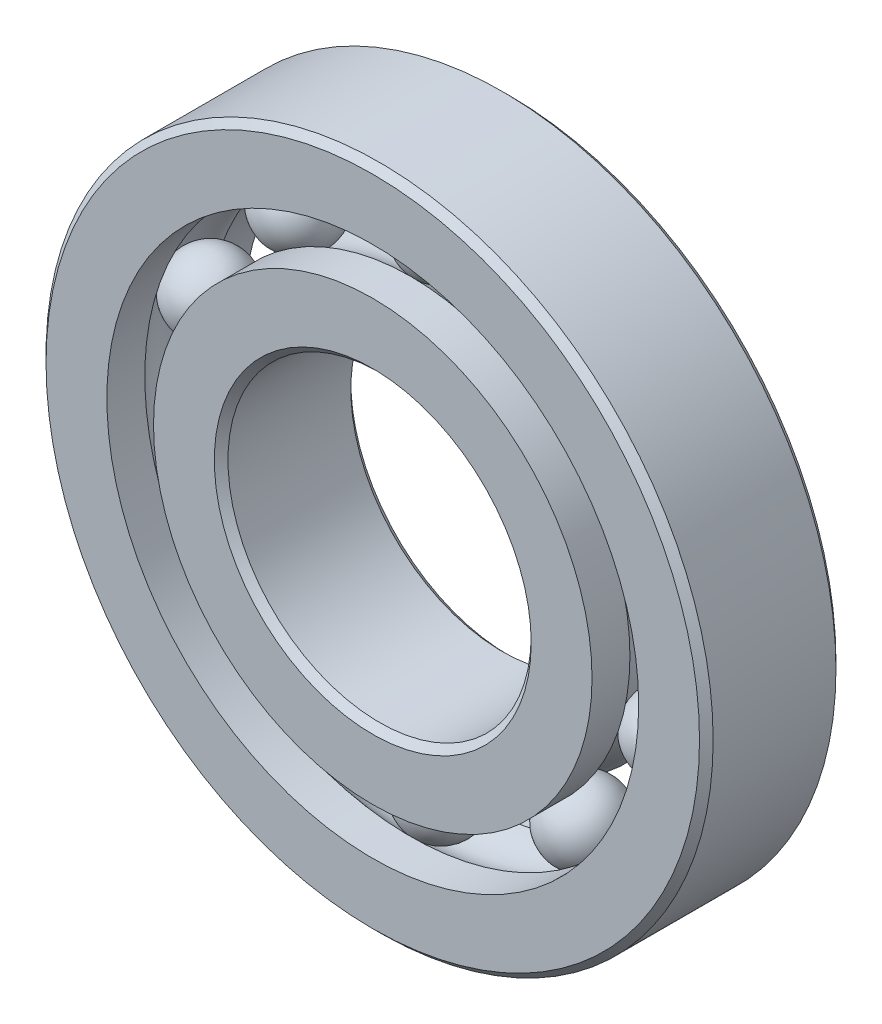
ISO-10303-21;
HEADER;
FILE_DESCRIPTION(('STEP AP214'),'2;1');
FILE_NAME('part.step','',(''),(''),'','','');
FILE_SCHEMA(('AUTOMOTIVE_DESIGN { 1 0 10303 214 1 1 1 1 }'));
ENDSEC;
DATA;
#1=APPLICATION_CONTEXT('core data for automotive mechanical design processes');
#2=APPLICATION_PROTOCOL_DEFINITION('international standard','automotive_design',2000,#1);
#3=PRODUCT_CONTEXT('',#1,'mechanical');
#4=PRODUCT('Part','Part','',(#3));
#5=PRODUCT_RELATED_PRODUCT_CATEGORY('part','',(#4));
#6=PRODUCT_DEFINITION_FORMATION('','',#4);
#7=PRODUCT_DEFINITION_CONTEXT('part definition',#1,'design');
#8=PRODUCT_DEFINITION('design','',#6,#7);
#9=PRODUCT_DEFINITION_SHAPE('','',#8);
#10=(LENGTH_UNIT() NAMED_UNIT(*) SI_UNIT(.MILLI.,.METRE.));
#11=(NAMED_UNIT(*) PLANE_ANGLE_UNIT() SI_UNIT($,.RADIAN.));
#12=(NAMED_UNIT(*) SI_UNIT($,.STERADIAN.) SOLID_ANGLE_UNIT());
#13=UNCERTAINTY_MEASURE_WITH_UNIT(LENGTH_MEASURE(1.E-05),#10,'distance_accuracy_value','');
#14=(GEOMETRIC_REPRESENTATION_CONTEXT(3) GLOBAL_UNCERTAINTY_ASSIGNED_CONTEXT((#13)) GLOBAL_UNIT_ASSIGNED_CONTEXT((#10,
#11,#12)) REPRESENTATION_CONTEXT('',''));
#15=CARTESIAN_POINT('',(0.,0.,0.));
#16=DIRECTION('',(0.,0.,1.));
#17=DIRECTION('',(1.,0.,0.));
#18=AXIS2_PLACEMENT_3D('',#15,#16,#17);
#19=CARTESIAN_POINT('',(-7.46487270411427,10.2745158285619,0.));
#20=DIRECTION('',(0.,0.,1.));
#21=DIRECTION('',(-0.587785252292462,0.809016994374955,0.));
#22=AXIS2_PLACEMENT_3D('',#19,#20,#21);
#23=SPHERICAL_SURFACE('',#22,2.00284122335654);
#24=CARTESIAN_POINT('',(-7.46487270411427,10.2745158285619,2.00284122335654));
#25=VERTEX_POINT('',#24);
#26=VERTEX_LOOP('',#25);
#27=FACE_BOUND('',#26,.T.);
#28=ADVANCED_FACE('F43',(#27),#23,.T.);
#29=CLOSED_SHELL('',(#28));
#30=MANIFOLD_SOLID_BREP('B2',#29);
#31=CARTESIAN_POINT('',(-12.0784177569484,3.92451582856197,0.));
#32=DIRECTION('',(0.,0.,1.));
#33=DIRECTION('',(-0.95105651629515,0.309016994374958,0.));
#34=AXIS2_PLACEMENT_3D('',#31,#32,#33);
#35=SPHERICAL_SURFACE('',#34,2.00284122335654);
#36=CARTESIAN_POINT('',(-12.0784177569484,3.92451582856197,2.00284122335654));
#37=VERTEX_POINT('',#36);
#38=VERTEX_LOOP('',#37);
#39=FACE_BOUND('',#38,.T.);
#40=ADVANCED_FACE('F64',(#39),#35,.T.);
#41=CLOSED_SHELL('',(#40));
#42=MANIFOLD_SOLID_BREP('B6',#41);
#43=CARTESIAN_POINT('',(-12.0784177569485,-3.92451582856172,0.));
#44=DIRECTION('',(0.,0.,1.));
#45=DIRECTION('',(-0.951056516295157,-0.309016994374938,0.));
#46=AXIS2_PLACEMENT_3D('',#43,#44,#45);
#47=SPHERICAL_SURFACE('',#46,2.00284122335654);
#48=CARTESIAN_POINT('',(-12.0784177569485,-3.92451582856172,2.00284122335654));
#49=VERTEX_POINT('',#48);
#50=VERTEX_LOOP('',#49);
#51=FACE_BOUND('',#50,.T.);
#52=ADVANCED_FACE('F87',(#51),#47,.T.);
#53=CLOSED_SHELL('',(#52));
#54=MANIFOLD_SOLID_BREP('B39',#53);
#55=CARTESIAN_POINT('',(-7.4648727041145,-10.2745158285618,0.));
#56=DIRECTION('',(0.,0.,1.));
#57=DIRECTION('',(-0.58778525229248,-0.809016994374942,0.));
#58=AXIS2_PLACEMENT_3D('',#55,#56,#57);
#59=SPHERICAL_SURFACE('',#58,2.00284122335654);
#60=CARTESIAN_POINT('',(-7.4648727041145,-10.2745158285618,2.00284122335654));
#61=VERTEX_POINT('',#60);
#62=VERTEX_LOOP('',#61);
#63=FACE_BOUND('',#62,.T.);
#64=ADVANCED_FACE('F107',(#63),#59,.T.);
#65=CLOSED_SHELL('',(#64));
#66=MANIFOLD_SOLID_BREP('B60',#65);
#67=CARTESIAN_POINT('',(0.,-12.7,0.));
#68=DIRECTION('',(0.,0.,1.));
#69=DIRECTION('',(0.,-1.,0.));
#70=AXIS2_PLACEMENT_3D('',#67,#68,#69);
#71=SPHERICAL_SURFACE('',#70,2.00284122335654);
#72=CARTESIAN_POINT('',(0.,-12.7,2.00284122335654));
#73=VERTEX_POINT('',#72);
#74=VERTEX_LOOP('',#73);
#75=FACE_BOUND('',#74,.T.);
#76=ADVANCED_FACE('F127',(#75),#71,.T.);
#77=CLOSED_SHELL('',(#76));
#78=MANIFOLD_SOLID_BREP('B83',#77);
#79=CARTESIAN_POINT('',(7.46487270411435,-10.2745158285619,0.));
#80=DIRECTION('',(0.,0.,1.));
#81=DIRECTION('',(0.587785252292469,-0.809016994374951,0.));
#82=AXIS2_PLACEMENT_3D('',#79,#80,#81);
#83=SPHERICAL_SURFACE('',#82,2.00284122335654);
#84=CARTESIAN_POINT('',(7.46487270411435,-10.2745158285619,2.00284122335654));
#85=VERTEX_POINT('',#84);
#86=VERTEX_LOOP('',#85);
#87=FACE_BOUND('',#86,.T.);
#88=ADVANCED_FACE('F147',(#87),#83,.T.);
#89=CLOSED_SHELL('',(#88));
#90=MANIFOLD_SOLID_BREP('B103',#89);
#91=CARTESIAN_POINT('',(12.0784177569484,-3.92451582856189,0.));
#92=DIRECTION('',(0.,0.,1.));
#93=DIRECTION('',(0.951056516295152,-0.309016994374952,0.));
#94=AXIS2_PLACEMENT_3D('',#91,#92,#93);
#95=SPHERICAL_SURFACE('',#94,2.00284122335654);
#96=CARTESIAN_POINT('',(12.0784177569484,-3.92451582856189,2.00284122335654));
#97=VERTEX_POINT('',#96);
#98=VERTEX_LOOP('',#97);
#99=FACE_BOUND('',#98,.T.);
#100=ADVANCED_FACE('F167',(#99),#95,.T.);
#101=CLOSED_SHELL('',(#100));
#102=MANIFOLD_SOLID_BREP('B123',#101);
#103=CARTESIAN_POINT('',(12.0784177569485,3.9245158285618,0.));
#104=DIRECTION('',(0.,0.,1.));
#105=DIRECTION('',(0.951056516295155,0.309016994374945,0.));
#106=AXIS2_PLACEMENT_3D('',#103,#104,#105);
#107=SPHERICAL_SURFACE('',#106,2.00284122335654);
#108=CARTESIAN_POINT('',(12.0784177569485,3.9245158285618,2.00284122335654));
#109=VERTEX_POINT('',#108);
#110=VERTEX_LOOP('',#109);
#111=FACE_BOUND('',#110,.T.);
#112=ADVANCED_FACE('F187',(#111),#107,.T.);
#113=CLOSED_SHELL('',(#112));
#114=MANIFOLD_SOLID_BREP('B143',#113);
#115=CARTESIAN_POINT('',(7.46487270411442,10.2745158285618,0.));
#116=DIRECTION('',(0.,0.,1.));
#117=DIRECTION('',(0.587785252292474,0.809016994374947,0.));
#118=AXIS2_PLACEMENT_3D('',#115,#116,#117);
#119=SPHERICAL_SURFACE('',#118,2.00284122335654);
#120=CARTESIAN_POINT('',(7.46487270411442,10.2745158285618,2.00284122335654));
#121=VERTEX_POINT('',#120);
#122=VERTEX_LOOP('',#121);
#123=FACE_BOUND('',#122,.T.);
#124=ADVANCED_FACE('F207',(#123),#119,.T.);
#125=CLOSED_SHELL('',(#124));
#126=MANIFOLD_SOLID_BREP('B163',#125);
#127=CARTESIAN_POINT('',(0.,12.7,0.));
#128=DIRECTION('',(0.,0.,1.));
#129=DIRECTION('',(0.,1.,0.));
#130=AXIS2_PLACEMENT_3D('',#127,#128,#129);
#131=SPHERICAL_SURFACE('',#130,2.00284122335654);
#132=CARTESIAN_POINT('',(0.,12.7,2.00284122335654));
#133=VERTEX_POINT('',#132);
#134=VERTEX_LOOP('',#133);
#135=FACE_BOUND('',#134,.T.);
#136=ADVANCED_FACE('F231',(#135),#131,.T.);
#137=CLOSED_SHELL('',(#136));
#138=MANIFOLD_SOLID_BREP('B183',#137);
#139=CARTESIAN_POINT('',(0.,11.4788461538462,3.571875));
#140=DIRECTION('',(0.,0.,-1.));
#141=DIRECTION('',(-1.,0.,0.));
#142=AXIS2_PLACEMENT_3D('',#139,#140,#141);
#143=PLANE('',#142);
#144=CARTESIAN_POINT('',(0.,0.,3.571875));
#145=DIRECTION('',(0.,0.,1.));
#146=DIRECTION('',(1.,0.,0.));
#147=AXIS2_PLACEMENT_3D('',#144,#145,#146);
#148=CIRCLE('',#147,8.2946875);
#149=CARTESIAN_POINT('',(8.2946875,0.,3.571875));
#150=VERTEX_POINT('',#149);
#151=EDGE_CURVE('E286',#150,#150,#148,.T.);
#152=ORIENTED_EDGE('',*,*,#151,.F.);
#153=EDGE_LOOP('',(#152));
#154=FACE_BOUND('',#153,.T.);
#155=CARTESIAN_POINT('',(0.,0.,3.571875));
#156=DIRECTION('',(0.,0.,1.));
#157=DIRECTION('',(1.,0.,0.));
#158=AXIS2_PLACEMENT_3D('',#155,#156,#157);
#159=CIRCLE('',#158,11.4788461538462);
#160=CARTESIAN_POINT('',(11.4788461538462,0.,3.571875));
#161=VERTEX_POINT('',#160);
#162=EDGE_CURVE('E230',#161,#161,#159,.T.);
#163=ORIENTED_EDGE('',*,*,#162,.T.);
#164=EDGE_LOOP('',(#163));
#165=FACE_BOUND('',#164,.T.);
#166=ADVANCED_FACE('F258',(#154,#165),#143,.F.);
#167=CARTESIAN_POINT('',(0.,0.,3.571875));
#168=DIRECTION('',(0.,0.,1.));
#169=DIRECTION('',(1.,0.,0.));
#170=AXIS2_PLACEMENT_3D('',#167,#168,#169);
#171=CYLINDRICAL_SURFACE('',#170,11.4788461538462);
#172=ORIENTED_EDGE('',*,*,#162,.F.);
#173=EDGE_LOOP('',(#172));
#174=FACE_BOUND('',#173,.T.);
#175=CARTESIAN_POINT('',(0.,0.,1.5875));
#176=DIRECTION('',(0.,0.,1.));
#177=DIRECTION('',(1.,0.,0.));
#178=AXIS2_PLACEMENT_3D('',#175,#176,#177);
#179=CIRCLE('',#178,11.4788461538462);
#180=CARTESIAN_POINT('',(11.4788461538462,0.,1.5875));
#181=VERTEX_POINT('',#180);
#182=EDGE_CURVE('E264',#181,#181,#179,.T.);
#183=ORIENTED_EDGE('',*,*,#182,.T.);
#184=EDGE_LOOP('',(#183));
#185=FACE_BOUND('',#184,.T.);
#186=ADVANCED_FACE('F293',(#174,#185),#171,.T.);
#187=CARTESIAN_POINT('',(0.,0.,0.));
#188=DIRECTION('',(0.,0.,1.));
#189=DIRECTION('',(1.,0.,0.));
#190=AXIS2_PLACEMENT_3D('',#187,#188,#189);
#191=TOROIDAL_SURFACE('',#190,12.7,2.00284122335654);
#192=ORIENTED_EDGE('',*,*,#182,.F.);
#193=EDGE_LOOP('',(#192));
#194=FACE_BOUND('',#193,.T.);
#195=CARTESIAN_POINT('',(0.,0.,-1.5875));
#196=DIRECTION('',(0.,0.,1.));
#197=DIRECTION('',(1.,0.,0.));
#198=AXIS2_PLACEMENT_3D('',#195,#196,#197);
#199=CIRCLE('',#198,11.4788461538462);
#200=CARTESIAN_POINT('',(11.4788461538462,0.,-1.5875));
#201=VERTEX_POINT('',#200);
#202=EDGE_CURVE('E268',#201,#201,#199,.T.);
#203=ORIENTED_EDGE('',*,*,#202,.T.);
#204=EDGE_LOOP('',(#203));
#205=FACE_BOUND('',#204,.T.);
#206=ADVANCED_FACE('F297',(#194,#205),#191,.F.);
#207=CARTESIAN_POINT('',(0.,0.,3.571875));
#208=DIRECTION('',(0.,0.,1.));
#209=DIRECTION('',(1.,0.,0.));
#210=AXIS2_PLACEMENT_3D('',#207,#208,#209);
#211=CYLINDRICAL_SURFACE('',#210,11.4788461538462);
#212=ORIENTED_EDGE('',*,*,#202,.F.);
#213=EDGE_LOOP('',(#212));
#214=FACE_BOUND('',#213,.T.);
#215=CARTESIAN_POINT('',(0.,0.,-3.571875));
#216=DIRECTION('',(0.,0.,1.));
#217=DIRECTION('',(1.,0.,0.));
#218=AXIS2_PLACEMENT_3D('',#215,#216,#217);
#219=CIRCLE('',#218,11.4788461538462);
#220=CARTESIAN_POINT('',(11.4788461538462,0.,-3.571875));
#221=VERTEX_POINT('',#220);
#222=EDGE_CURVE('E272',#221,#221,#219,.T.);
#223=ORIENTED_EDGE('',*,*,#222,.T.);
#224=EDGE_LOOP('',(#223));
#225=FACE_BOUND('',#224,.T.);
#226=ADVANCED_FACE('F302',(#214,#225),#211,.T.);
#227=CARTESIAN_POINT('',(0.,8.2946875,-3.571875));
#228=DIRECTION('',(0.,0.,1.));
#229=DIRECTION('',(1.,0.,0.));
#230=AXIS2_PLACEMENT_3D('',#227,#228,#229);
#231=PLANE('',#230);
#232=ORIENTED_EDGE('',*,*,#222,.F.);
#233=EDGE_LOOP('',(#232));
#234=FACE_BOUND('',#233,.T.);
#235=CARTESIAN_POINT('',(0.,0.,-3.571875));
#236=DIRECTION('',(0.,0.,1.));
#237=DIRECTION('',(1.,0.,0.));
#238=AXIS2_PLACEMENT_3D('',#235,#236,#237);
#239=CIRCLE('',#238,8.2946875);
#240=CARTESIAN_POINT('',(8.2946875,0.,-3.571875));
#241=VERTEX_POINT('',#240);
#242=EDGE_CURVE('E277',#241,#241,#239,.T.);
#243=ORIENTED_EDGE('',*,*,#242,.T.);
#244=EDGE_LOOP('',(#243));
#245=FACE_BOUND('',#244,.T.);
#246=ADVANCED_FACE('F308',(#234,#245),#231,.F.);
#247=CARTESIAN_POINT('',(0.,0.,-3.2146875));
#248=DIRECTION('',(0.,0.,-1.));
#249=DIRECTION('',(-1.,0.,0.));
#250=AXIS2_PLACEMENT_3D('',#247,#248,#249);
#251=CONICAL_SURFACE('',#250,7.9375,0.785398163397446);
#252=ORIENTED_EDGE('',*,*,#242,.F.);
#253=EDGE_LOOP('',(#252));
#254=FACE_BOUND('',#253,.T.);
#255=CARTESIAN_POINT('',(0.,0.,-3.2146875));
#256=DIRECTION('',(0.,0.,1.));
#257=DIRECTION('',(1.,0.,0.));
#258=AXIS2_PLACEMENT_3D('',#255,#256,#257);
#259=CIRCLE('',#258,7.9375);
#260=CARTESIAN_POINT('',(7.9375,0.,-3.2146875));
#261=VERTEX_POINT('',#260);
#262=EDGE_CURVE('E280',#261,#261,#259,.T.);
#263=ORIENTED_EDGE('',*,*,#262,.T.);
#264=EDGE_LOOP('',(#263));
#265=FACE_BOUND('',#264,.T.);
#266=ADVANCED_FACE('F312',(#254,#265),#251,.F.);
#267=CARTESIAN_POINT('',(0.,0.,3.571875));
#268=DIRECTION('',(0.,0.,1.));
#269=DIRECTION('',(1.,0.,0.));
#270=AXIS2_PLACEMENT_3D('',#267,#268,#269);
#271=CYLINDRICAL_SURFACE('',#270,7.9375);
#272=ORIENTED_EDGE('',*,*,#262,.F.);
#273=EDGE_LOOP('',(#272));
#274=FACE_BOUND('',#273,.T.);
#275=CARTESIAN_POINT('',(0.,0.,3.2146875));
#276=DIRECTION('',(0.,0.,1.));
#277=DIRECTION('',(1.,0.,0.));
#278=AXIS2_PLACEMENT_3D('',#275,#276,#277);
#279=CIRCLE('',#278,7.9375);
#280=CARTESIAN_POINT('',(7.9375,0.,3.2146875));
#281=VERTEX_POINT('',#280);
#282=EDGE_CURVE('E283',#281,#281,#279,.T.);
#283=ORIENTED_EDGE('',*,*,#282,.T.);
#284=EDGE_LOOP('',(#283));
#285=FACE_BOUND('',#284,.T.);
#286=ADVANCED_FACE('F316',(#274,#285),#271,.F.);
#287=CARTESIAN_POINT('',(0.,0.,3.571875));
#288=DIRECTION('',(0.,0.,1.));
#289=DIRECTION('',(1.,0.,0.));
#290=AXIS2_PLACEMENT_3D('',#287,#288,#289);
#291=CONICAL_SURFACE('',#290,8.2946875,0.785398163397451);
#292=ORIENTED_EDGE('',*,*,#282,.F.);
#293=EDGE_LOOP('',(#292));
#294=FACE_BOUND('',#293,.T.);
#295=ORIENTED_EDGE('',*,*,#151,.T.);
#296=EDGE_LOOP('',(#295));
#297=FACE_BOUND('',#296,.T.);
#298=ADVANCED_FACE('F290',(#294,#297),#291,.F.);
#299=CLOSED_SHELL('',(#166,#186,#206,#226,#246,#266,#286,#298));
#300=MANIFOLD_SOLID_BREP('B203',#299);
#301=CARTESIAN_POINT('',(0.,0.,3.2146875));
#302=DIRECTION('',(0.,0.,-1.));
#303=DIRECTION('',(-1.,0.,0.));
#304=AXIS2_PLACEMENT_3D('',#301,#302,#303);
#305=CONICAL_SURFACE('',#304,17.4625,0.785398163397446);
#306=CARTESIAN_POINT('',(0.,0.,3.571875));
#307=DIRECTION('',(0.,0.,1.));
#308=DIRECTION('',(1.,0.,0.));
#309=AXIS2_PLACEMENT_3D('',#306,#307,#308);
#310=CIRCLE('',#309,17.1053125);
#311=CARTESIAN_POINT('',(17.1053125,0.,3.571875));
#312=VERTEX_POINT('',#311);
#313=EDGE_CURVE('E413',#312,#312,#310,.T.);
#314=ORIENTED_EDGE('',*,*,#313,.F.);
#315=EDGE_LOOP('',(#314));
#316=FACE_BOUND('',#315,.T.);
#317=CARTESIAN_POINT('',(0.,0.,3.2146875));
#318=DIRECTION('',(0.,0.,1.));
#319=DIRECTION('',(1.,0.,0.));
#320=AXIS2_PLACEMENT_3D('',#317,#318,#319);
#321=CIRCLE('',#320,17.4625);
#322=CARTESIAN_POINT('',(17.4625,0.,3.2146875));
#323=VERTEX_POINT('',#322);
#324=EDGE_CURVE('E257',#323,#323,#321,.T.);
#325=ORIENTED_EDGE('',*,*,#324,.T.);
#326=EDGE_LOOP('',(#325));
#327=FACE_BOUND('',#326,.T.);
#328=ADVANCED_FACE('F385',(#316,#327),#305,.T.);
#329=CARTESIAN_POINT('',(0.,0.,3.571875));
#330=DIRECTION('',(0.,0.,1.));
#331=DIRECTION('',(1.,0.,0.));
#332=AXIS2_PLACEMENT_3D('',#329,#330,#331);
#333=CYLINDRICAL_SURFACE('',#332,17.4625);
#334=ORIENTED_EDGE('',*,*,#324,.F.);
#335=EDGE_LOOP('',(#334));
#336=FACE_BOUND('',#335,.T.);
#337=CARTESIAN_POINT('',(0.,0.,-3.2146875));
#338=DIRECTION('',(0.,0.,1.));
#339=DIRECTION('',(1.,0.,0.));
#340=AXIS2_PLACEMENT_3D('',#337,#338,#339);
#341=CIRCLE('',#340,17.4625);
#342=CARTESIAN_POINT('',(17.4625,0.,-3.2146875));
#343=VERTEX_POINT('',#342);
#344=EDGE_CURVE('E391',#343,#343,#341,.T.);
#345=ORIENTED_EDGE('',*,*,#344,.T.);
#346=EDGE_LOOP('',(#345));
#347=FACE_BOUND('',#346,.T.);
#348=ADVANCED_FACE('F420',(#336,#347),#333,.T.);
#349=CARTESIAN_POINT('',(0.,0.,-3.571875));
#350=DIRECTION('',(0.,0.,1.));
#351=DIRECTION('',(1.,0.,0.));
#352=AXIS2_PLACEMENT_3D('',#349,#350,#351);
#353=CONICAL_SURFACE('',#352,17.1053125,0.785398163397446);
#354=ORIENTED_EDGE('',*,*,#344,.F.);
#355=EDGE_LOOP('',(#354));
#356=FACE_BOUND('',#355,.T.);
#357=CARTESIAN_POINT('',(0.,0.,-3.571875));
#358=DIRECTION('',(0.,0.,1.));
#359=DIRECTION('',(1.,0.,0.));
#360=AXIS2_PLACEMENT_3D('',#357,#358,#359);
#361=CIRCLE('',#360,17.1053125);
#362=CARTESIAN_POINT('',(17.1053125,0.,-3.571875));
#363=VERTEX_POINT('',#362);
#364=EDGE_CURVE('E395',#363,#363,#361,.T.);
#365=ORIENTED_EDGE('',*,*,#364,.T.);
#366=EDGE_LOOP('',(#365));
#367=FACE_BOUND('',#366,.T.);
#368=ADVANCED_FACE('F424',(#356,#367),#353,.T.);
#369=CARTESIAN_POINT('',(0.,17.1053125,-3.571875));
#370=DIRECTION('',(0.,0.,1.));
#371=DIRECTION('',(1.,0.,0.));
#372=AXIS2_PLACEMENT_3D('',#369,#370,#371);
#373=PLANE('',#372);
#374=ORIENTED_EDGE('',*,*,#364,.F.);
#375=EDGE_LOOP('',(#374));
#376=FACE_BOUND('',#375,.T.);
#377=CARTESIAN_POINT('',(0.,0.,-3.571875));
#378=DIRECTION('',(0.,0.,1.));
#379=DIRECTION('',(1.,0.,0.));
#380=AXIS2_PLACEMENT_3D('',#377,#378,#379);
#381=CIRCLE('',#380,13.9211538461538);
#382=CARTESIAN_POINT('',(13.9211538461538,0.,-3.571875));
#383=VERTEX_POINT('',#382);
#384=EDGE_CURVE('E399',#383,#383,#381,.T.);
#385=ORIENTED_EDGE('',*,*,#384,.T.);
#386=EDGE_LOOP('',(#385));
#387=FACE_BOUND('',#386,.T.);
#388=ADVANCED_FACE('F429',(#376,#387),#373,.F.);
#389=CARTESIAN_POINT('',(0.,0.,3.571875));
#390=DIRECTION('',(0.,0.,1.));
#391=DIRECTION('',(1.,0.,0.));
#392=AXIS2_PLACEMENT_3D('',#389,#390,#391);
#393=CYLINDRICAL_SURFACE('',#392,13.9211538461538);
#394=ORIENTED_EDGE('',*,*,#384,.F.);
#395=EDGE_LOOP('',(#394));
#396=FACE_BOUND('',#395,.T.);
#397=CARTESIAN_POINT('',(0.,0.,-1.5875));
#398=DIRECTION('',(0.,0.,1.));
#399=DIRECTION('',(1.,0.,0.));
#400=AXIS2_PLACEMENT_3D('',#397,#398,#399);
#401=CIRCLE('',#400,13.9211538461538);
#402=CARTESIAN_POINT('',(13.9211538461538,0.,-1.5875));
#403=VERTEX_POINT('',#402);
#404=EDGE_CURVE('E404',#403,#403,#401,.T.);
#405=ORIENTED_EDGE('',*,*,#404,.T.);
#406=EDGE_LOOP('',(#405));
#407=FACE_BOUND('',#406,.T.);
#408=ADVANCED_FACE('F435',(#396,#407),#393,.F.);
#409=CARTESIAN_POINT('',(0.,0.,0.));
#410=DIRECTION('',(0.,0.,1.));
#411=DIRECTION('',(1.,0.,0.));
#412=AXIS2_PLACEMENT_3D('',#409,#410,#411);
#413=TOROIDAL_SURFACE('',#412,12.7,2.00284122335654);
#414=ORIENTED_EDGE('',*,*,#404,.F.);
#415=EDGE_LOOP('',(#414));
#416=FACE_BOUND('',#415,.T.);
#417=CARTESIAN_POINT('',(0.,0.,1.5875));
#418=DIRECTION('',(0.,0.,1.));
#419=DIRECTION('',(1.,0.,0.));
#420=AXIS2_PLACEMENT_3D('',#417,#418,#419);
#421=CIRCLE('',#420,13.9211538461538);
#422=CARTESIAN_POINT('',(13.9211538461538,0.,1.5875));
#423=VERTEX_POINT('',#422);
#424=EDGE_CURVE('E407',#423,#423,#421,.T.);
#425=ORIENTED_EDGE('',*,*,#424,.T.);
#426=EDGE_LOOP('',(#425));
#427=FACE_BOUND('',#426,.T.);
#428=ADVANCED_FACE('F439',(#416,#427),#413,.F.);
#429=CARTESIAN_POINT('',(0.,0.,3.571875));
#430=DIRECTION('',(0.,0.,1.));
#431=DIRECTION('',(1.,0.,0.));
#432=AXIS2_PLACEMENT_3D('',#429,#430,#431);
#433=CYLINDRICAL_SURFACE('',#432,13.9211538461538);
#434=ORIENTED_EDGE('',*,*,#424,.F.);
#435=EDGE_LOOP('',(#434));
#436=FACE_BOUND('',#435,.T.);
#437=CARTESIAN_POINT('',(0.,0.,3.571875));
#438=DIRECTION('',(0.,0.,1.));
#439=DIRECTION('',(1.,0.,0.));
#440=AXIS2_PLACEMENT_3D('',#437,#438,#439);
#441=CIRCLE('',#440,13.9211538461538);
#442=CARTESIAN_POINT('',(13.9211538461538,0.,3.571875));
#443=VERTEX_POINT('',#442);
#444=EDGE_CURVE('E410',#443,#443,#441,.T.);
#445=ORIENTED_EDGE('',*,*,#444,.T.);
#446=EDGE_LOOP('',(#445));
#447=FACE_BOUND('',#446,.T.);
#448=ADVANCED_FACE('F443',(#436,#447),#433,.F.);
#449=CARTESIAN_POINT('',(0.,17.1053125,3.571875));
#450=DIRECTION('',(0.,0.,-1.));
#451=DIRECTION('',(-1.,0.,0.));
#452=AXIS2_PLACEMENT_3D('',#449,#450,#451);
#453=PLANE('',#452);
#454=ORIENTED_EDGE('',*,*,#444,.F.);
#455=EDGE_LOOP('',(#454));
#456=FACE_BOUND('',#455,.T.);
#457=ORIENTED_EDGE('',*,*,#313,.T.);
#458=EDGE_LOOP('',(#457));
#459=FACE_BOUND('',#458,.T.);
#460=ADVANCED_FACE('F417',(#456,#459),#453,.F.);
#461=CLOSED_SHELL('',(#328,#348,#368,#388,#408,#428,#448,#460));
#462=MANIFOLD_SOLID_BREP('B225',#461);
#463=ADVANCED_BREP_SHAPE_REPRESENTATION('',(#18,#30,#42,#54,#66,#78,#90,#102,#114,#126,#138,
#300,#462),#14);
#464=SHAPE_DEFINITION_REPRESENTATION(#9,#463);
ENDSEC;
END-ISO-10303-21;
